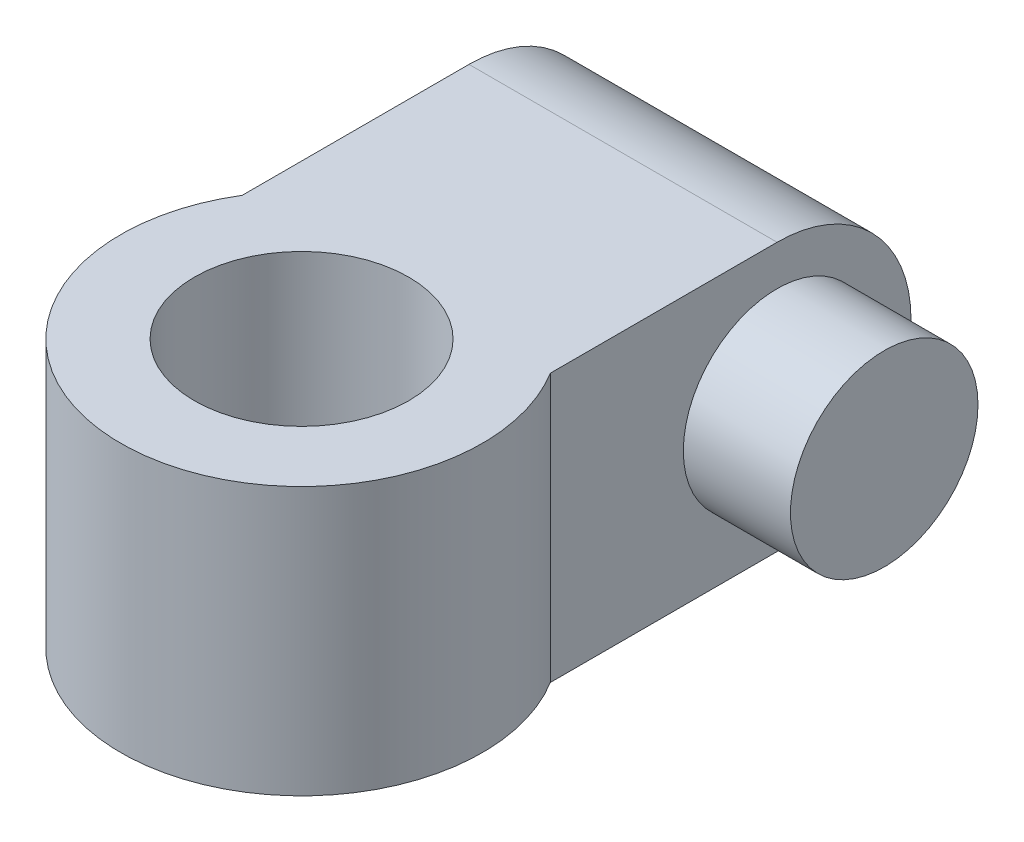
ISO-10303-21;
HEADER;
FILE_DESCRIPTION(('STEP AP214'),'2;1');
FILE_NAME('part.step','',(''),(''),'','','');
FILE_SCHEMA(('AUTOMOTIVE_DESIGN { 1 0 10303 214 1 1 1 1 }'));
ENDSEC;
DATA;
#1=APPLICATION_CONTEXT('core data for automotive mechanical design processes');
#2=APPLICATION_PROTOCOL_DEFINITION('international standard','automotive_design',2000,#1);
#3=PRODUCT_CONTEXT('',#1,'mechanical');
#4=PRODUCT('Part','Part','',(#3));
#5=PRODUCT_RELATED_PRODUCT_CATEGORY('part','',(#4));
#6=PRODUCT_DEFINITION_FORMATION('','',#4);
#7=PRODUCT_DEFINITION_CONTEXT('part definition',#1,'design');
#8=PRODUCT_DEFINITION('design','',#6,#7);
#9=PRODUCT_DEFINITION_SHAPE('','',#8);
#10=(LENGTH_UNIT() NAMED_UNIT(*) SI_UNIT(.MILLI.,.METRE.));
#11=(NAMED_UNIT(*) PLANE_ANGLE_UNIT() SI_UNIT($,.RADIAN.));
#12=(NAMED_UNIT(*) SI_UNIT($,.STERADIAN.) SOLID_ANGLE_UNIT());
#13=UNCERTAINTY_MEASURE_WITH_UNIT(LENGTH_MEASURE(1.E-05),#10,'distance_accuracy_value','');
#14=(GEOMETRIC_REPRESENTATION_CONTEXT(3) GLOBAL_UNCERTAINTY_ASSIGNED_CONTEXT((#13)) GLOBAL_UNIT_ASSIGNED_CONTEXT((#10,
#11,#12)) REPRESENTATION_CONTEXT('',''));
#15=CARTESIAN_POINT('',(0.,0.,0.));
#16=DIRECTION('',(0.,0.,1.));
#17=DIRECTION('',(1.,0.,0.));
#18=AXIS2_PLACEMENT_3D('',#15,#16,#17);
#19=CARTESIAN_POINT('',(0.,-5.,0.));
#20=DIRECTION('',(0.,1.,0.));
#21=DIRECTION('',(1.,0.,0.));
#22=AXIS2_PLACEMENT_3D('',#19,#20,#21);
#23=PLANE('',#22);
#24=DIRECTION('',(1.,0.,0.));
#25=VECTOR('',#24,1.);
#26=CARTESIAN_POINT('',(-5.75,-5.,-12.));
#27=LINE('',#26,#25);
#28=CARTESIAN_POINT('',(-5.75,-5.,-12.));
#29=VERTEX_POINT('',#28);
#30=CARTESIAN_POINT('',(5.75,-5.,-12.));
#31=VERTEX_POINT('',#30);
#32=EDGE_CURVE('E11',#29,#31,#27,.T.);
#33=ORIENTED_EDGE('',*,*,#32,.T.);
#34=DIRECTION('',(0.,0.,-1.));
#35=VECTOR('',#34,1.);
#36=CARTESIAN_POINT('',(5.75,-5.,-3.535533905933));
#37=LINE('',#36,#35);
#38=CARTESIAN_POINT('',(5.75,-5.,-3.535533905933));
#39=VERTEX_POINT('',#38);
#40=EDGE_CURVE('E36',#39,#31,#37,.T.);
#41=ORIENTED_EDGE('',*,*,#40,.F.);
#42=CARTESIAN_POINT('',(0.,-5.,0.));
#43=DIRECTION('',(0.,-1.,0.));
#44=DIRECTION('',(0.851851851851876,0.,-0.523782800878885));
#45=AXIS2_PLACEMENT_3D('',#42,#43,#44);
#46=CIRCLE('',#45,6.75);
#47=CARTESIAN_POINT('',(-5.75,-5.,-3.535533905933));
#48=VERTEX_POINT('',#47);
#49=EDGE_CURVE('E27',#39,#48,#46,.T.);
#50=ORIENTED_EDGE('',*,*,#49,.T.);
#51=DIRECTION('',(0.,0.,1.));
#52=VECTOR('',#51,1.);
#53=CARTESIAN_POINT('',(-5.75,-5.,-12.));
#54=LINE('',#53,#52);
#55=EDGE_CURVE('E97',#29,#48,#54,.T.);
#56=ORIENTED_EDGE('',*,*,#55,.F.);
#57=EDGE_LOOP('',(#33,#41,#50,#56));
#58=FACE_BOUND('',#57,.T.);
#59=CARTESIAN_POINT('',(0.,-5.,0.));
#60=DIRECTION('',(0.,-1.,0.));
#61=DIRECTION('',(-1.,0.,0.));
#62=AXIS2_PLACEMENT_3D('',#59,#60,#61);
#63=CIRCLE('',#62,4.);
#64=CARTESIAN_POINT('',(-4.,-5.,0.));
#65=VERTEX_POINT('',#64);
#66=EDGE_CURVE('E85',#65,#65,#63,.T.);
#67=ORIENTED_EDGE('',*,*,#66,.F.);
#68=EDGE_LOOP('',(#67));
#69=FACE_BOUND('',#68,.T.);
#70=ADVANCED_FACE('F17',(#58,#69),#23,.F.);
#71=CARTESIAN_POINT('',(-5.75,0.,0.));
#72=DIRECTION('',(1.,0.,0.));
#73=DIRECTION('',(0.,0.,-1.));
#74=AXIS2_PLACEMENT_3D('',#71,#72,#73);
#75=PLANE('',#74);
#76=DIRECTION('',(0.,0.,-1.));
#77=VECTOR('',#76,1.);
#78=CARTESIAN_POINT('',(-5.75,5.,-3.535533905933));
#79=LINE('',#78,#77);
#80=CARTESIAN_POINT('',(-5.75,5.,-3.535533905933));
#81=VERTEX_POINT('',#80);
#82=CARTESIAN_POINT('',(-5.75,5.,-12.));
#83=VERTEX_POINT('',#82);
#84=EDGE_CURVE('E99',#81,#83,#79,.T.);
#85=ORIENTED_EDGE('',*,*,#84,.T.);
#86=CARTESIAN_POINT('',(-5.75,0.,-12.));
#87=DIRECTION('',(1.,0.,0.));
#88=DIRECTION('',(0.,-1.,0.));
#89=AXIS2_PLACEMENT_3D('',#86,#87,#88);
#90=CIRCLE('',#89,5.);
#91=EDGE_CURVE('E72',#29,#83,#90,.T.);
#92=ORIENTED_EDGE('',*,*,#91,.F.);
#93=ORIENTED_EDGE('',*,*,#55,.T.);
#94=DIRECTION('',(0.,1.,0.));
#95=VECTOR('',#94,1.);
#96=CARTESIAN_POINT('',(-5.75,-5.,-3.535533905933));
#97=LINE('',#96,#95);
#98=EDGE_CURVE('E102',#48,#81,#97,.T.);
#99=ORIENTED_EDGE('',*,*,#98,.T.);
#100=EDGE_LOOP('',(#85,#92,#93,#99));
#101=FACE_BOUND('',#100,.T.);
#102=CARTESIAN_POINT('',(-5.75,0.,-12.));
#103=DIRECTION('',(-1.,0.,0.));
#104=DIRECTION('',(0.,0.,-1.));
#105=AXIS2_PLACEMENT_3D('',#102,#103,#104);
#106=CIRCLE('',#105,2.);
#107=CARTESIAN_POINT('',(-5.75,0.,-14.));
#108=VERTEX_POINT('',#107);
#109=EDGE_CURVE('E89',#108,#108,#106,.T.);
#110=ORIENTED_EDGE('',*,*,#109,.F.);
#111=EDGE_LOOP('',(#110));
#112=FACE_BOUND('',#111,.T.);
#113=ADVANCED_FACE('F123',(#101,#112),#75,.F.);
#114=CARTESIAN_POINT('',(0.,-5.,0.));
#115=DIRECTION('',(0.,1.,0.));
#116=DIRECTION('',(1.,0.,0.));
#117=AXIS2_PLACEMENT_3D('',#114,#115,#116);
#118=CYLINDRICAL_SURFACE('',#117,6.75);
#119=DIRECTION('',(0.,1.,0.));
#120=VECTOR('',#119,1.);
#121=CARTESIAN_POINT('',(5.75,-5.,-3.535533905933));
#122=LINE('',#121,#120);
#123=CARTESIAN_POINT('',(5.75,5.,-3.535533905933));
#124=VERTEX_POINT('',#123);
#125=EDGE_CURVE('E103',#39,#124,#122,.T.);
#126=ORIENTED_EDGE('',*,*,#125,.T.);
#127=CARTESIAN_POINT('',(0.,5.,0.));
#128=DIRECTION('',(0.,1.,0.));
#129=DIRECTION('',(-0.851851851851876,0.,-0.523782800878885));
#130=AXIS2_PLACEMENT_3D('',#127,#128,#129);
#131=CIRCLE('',#130,6.75);
#132=EDGE_CURVE('E55',#81,#124,#131,.T.);
#133=ORIENTED_EDGE('',*,*,#132,.F.);
#134=ORIENTED_EDGE('',*,*,#98,.F.);
#135=ORIENTED_EDGE('',*,*,#49,.F.);
#136=EDGE_LOOP('',(#126,#133,#134,#135));
#137=FACE_BOUND('',#136,.T.);
#138=ADVANCED_FACE('F129',(#137),#118,.T.);
#139=CARTESIAN_POINT('',(0.,5.,0.));
#140=DIRECTION('',(0.,1.,0.));
#141=DIRECTION('',(1.,0.,0.));
#142=AXIS2_PLACEMENT_3D('',#139,#140,#141);
#143=PLANE('',#142);
#144=DIRECTION('',(0.,0.,1.));
#145=VECTOR('',#144,1.);
#146=CARTESIAN_POINT('',(5.75,5.,-12.));
#147=LINE('',#146,#145);
#148=CARTESIAN_POINT('',(5.75,5.,-12.));
#149=VERTEX_POINT('',#148);
#150=EDGE_CURVE('E59',#149,#124,#147,.T.);
#151=ORIENTED_EDGE('',*,*,#150,.F.);
#152=DIRECTION('',(1.,0.,0.));
#153=VECTOR('',#152,1.);
#154=CARTESIAN_POINT('',(-5.75,5.,-12.));
#155=LINE('',#154,#153);
#156=EDGE_CURVE('E63',#83,#149,#155,.T.);
#157=ORIENTED_EDGE('',*,*,#156,.F.);
#158=ORIENTED_EDGE('',*,*,#84,.F.);
#159=ORIENTED_EDGE('',*,*,#132,.T.);
#160=EDGE_LOOP('',(#151,#157,#158,#159));
#161=FACE_BOUND('',#160,.T.);
#162=CARTESIAN_POINT('',(0.,5.,0.));
#163=DIRECTION('',(0.,-1.,0.));
#164=DIRECTION('',(-1.,0.,0.));
#165=AXIS2_PLACEMENT_3D('',#162,#163,#164);
#166=CIRCLE('',#165,4.);
#167=CARTESIAN_POINT('',(-4.,5.,0.));
#168=VERTEX_POINT('',#167);
#169=EDGE_CURVE('E74',#168,#168,#166,.T.);
#170=ORIENTED_EDGE('',*,*,#169,.T.);
#171=EDGE_LOOP('',(#170));
#172=FACE_BOUND('',#171,.T.);
#173=ADVANCED_FACE('F61',(#161,#172),#143,.T.);
#174=CARTESIAN_POINT('',(-5.75,0.,-12.));
#175=DIRECTION('',(1.,0.,0.));
#176=DIRECTION('',(0.,0.,-1.));
#177=AXIS2_PLACEMENT_3D('',#174,#175,#176);
#178=CYLINDRICAL_SURFACE('',#177,5.);
#179=ORIENTED_EDGE('',*,*,#156,.T.);
#180=CARTESIAN_POINT('',(5.75,0.,-12.));
#181=DIRECTION('',(1.,0.,0.));
#182=DIRECTION('',(0.,-1.,0.));
#183=AXIS2_PLACEMENT_3D('',#180,#181,#182);
#184=CIRCLE('',#183,5.);
#185=EDGE_CURVE('E64',#31,#149,#184,.T.);
#186=ORIENTED_EDGE('',*,*,#185,.F.);
#187=ORIENTED_EDGE('',*,*,#32,.F.);
#188=ORIENTED_EDGE('',*,*,#91,.T.);
#189=EDGE_LOOP('',(#179,#186,#187,#188));
#190=FACE_BOUND('',#189,.T.);
#191=ADVANCED_FACE('F69',(#190),#178,.T.);
#192=CARTESIAN_POINT('',(5.75,0.,0.));
#193=DIRECTION('',(1.,0.,0.));
#194=DIRECTION('',(0.,0.,-1.));
#195=AXIS2_PLACEMENT_3D('',#192,#193,#194);
#196=PLANE('',#195);
#197=ORIENTED_EDGE('',*,*,#40,.T.);
#198=ORIENTED_EDGE('',*,*,#185,.T.);
#199=ORIENTED_EDGE('',*,*,#150,.T.);
#200=ORIENTED_EDGE('',*,*,#125,.F.);
#201=EDGE_LOOP('',(#197,#198,#199,#200));
#202=FACE_BOUND('',#201,.T.);
#203=CARTESIAN_POINT('',(5.75,0.,-12.));
#204=DIRECTION('',(1.,0.,0.));
#205=DIRECTION('',(0.,0.,1.));
#206=AXIS2_PLACEMENT_3D('',#203,#204,#205);
#207=CIRCLE('',#206,3.5);
#208=CARTESIAN_POINT('',(5.75,0.,-8.5));
#209=VERTEX_POINT('',#208);
#210=EDGE_CURVE('E65',#209,#209,#207,.T.);
#211=ORIENTED_EDGE('',*,*,#210,.F.);
#212=EDGE_LOOP('',(#211));
#213=FACE_BOUND('',#212,.T.);
#214=ADVANCED_FACE('F76',(#202,#213),#196,.T.);
#215=CARTESIAN_POINT('',(5.75,0.,-12.));
#216=DIRECTION('',(1.,0.,0.));
#217=DIRECTION('',(0.,0.,-1.));
#218=AXIS2_PLACEMENT_3D('',#215,#216,#217);
#219=CYLINDRICAL_SURFACE('',#218,3.5);
#220=CARTESIAN_POINT('',(9.75,0.,-12.));
#221=DIRECTION('',(1.,0.,0.));
#222=DIRECTION('',(0.,0.,-1.));
#223=AXIS2_PLACEMENT_3D('',#220,#221,#222);
#224=CIRCLE('',#223,3.5);
#225=CARTESIAN_POINT('',(9.75,0.,-15.5));
#226=VERTEX_POINT('',#225);
#227=EDGE_CURVE('E83',#226,#226,#224,.T.);
#228=ORIENTED_EDGE('',*,*,#227,.F.);
#229=EDGE_LOOP('',(#228));
#230=FACE_BOUND('',#229,.T.);
#231=ORIENTED_EDGE('',*,*,#210,.T.);
#232=EDGE_LOOP('',(#231));
#233=FACE_BOUND('',#232,.T.);
#234=ADVANCED_FACE('F120',(#230,#233),#219,.T.);
#235=CARTESIAN_POINT('',(9.75,0.,0.));
#236=DIRECTION('',(1.,0.,0.));
#237=DIRECTION('',(0.,0.,-1.));
#238=AXIS2_PLACEMENT_3D('',#235,#236,#237);
#239=PLANE('',#238);
#240=ORIENTED_EDGE('',*,*,#227,.T.);
#241=EDGE_LOOP('',(#240));
#242=FACE_BOUND('',#241,.T.);
#243=ADVANCED_FACE('F112',(#242),#239,.T.);
#244=CARTESIAN_POINT('',(0.,5.,0.));
#245=DIRECTION('',(0.,-1.,0.));
#246=DIRECTION('',(1.,0.,0.));
#247=AXIS2_PLACEMENT_3D('',#244,#245,#246);
#248=CYLINDRICAL_SURFACE('',#247,4.);
#249=ORIENTED_EDGE('',*,*,#66,.T.);
#250=EDGE_LOOP('',(#249));
#251=FACE_BOUND('',#250,.T.);
#252=ORIENTED_EDGE('',*,*,#169,.F.);
#253=EDGE_LOOP('',(#252));
#254=FACE_BOUND('',#253,.T.);
#255=ADVANCED_FACE('F109',(#251,#254),#248,.F.);
#256=CARTESIAN_POINT('',(-5.75,0.,-12.));
#257=DIRECTION('',(-1.,0.,0.));
#258=DIRECTION('',(0.,0.,1.));
#259=AXIS2_PLACEMENT_3D('',#256,#257,#258);
#260=CYLINDRICAL_SURFACE('',#259,2.);
#261=CARTESIAN_POINT('',(-8.75,0.,-12.));
#262=DIRECTION('',(-1.,0.,0.));
#263=DIRECTION('',(0.,0.,1.));
#264=AXIS2_PLACEMENT_3D('',#261,#262,#263);
#265=CIRCLE('',#264,2.);
#266=CARTESIAN_POINT('',(-8.75,0.,-10.));
#267=VERTEX_POINT('',#266);
#268=EDGE_CURVE('E21',#267,#267,#265,.T.);
#269=ORIENTED_EDGE('',*,*,#268,.F.);
#270=EDGE_LOOP('',(#269));
#271=FACE_BOUND('',#270,.T.);
#272=ORIENTED_EDGE('',*,*,#109,.T.);
#273=EDGE_LOOP('',(#272));
#274=FACE_BOUND('',#273,.T.);
#275=ADVANCED_FACE('F111',(#271,#274),#260,.T.);
#276=CARTESIAN_POINT('',(-8.75,0.,0.));
#277=DIRECTION('',(-1.,0.,0.));
#278=DIRECTION('',(0.,0.,1.));
#279=AXIS2_PLACEMENT_3D('',#276,#277,#278);
#280=PLANE('',#279);
#281=ORIENTED_EDGE('',*,*,#268,.T.);
#282=EDGE_LOOP('',(#281));
#283=FACE_BOUND('',#282,.T.);
#284=ADVANCED_FACE('F19',(#283),#280,.T.);
#285=CLOSED_SHELL('',(#70,#113,#138,#173,#191,#214,#234,#243,#255,#275,#284));
#286=MANIFOLD_SOLID_BREP('B1',#285);
#287=ADVANCED_BREP_SHAPE_REPRESENTATION('',(#18,#286),#14);
#288=SHAPE_DEFINITION_REPRESENTATION(#9,#287);
ENDSEC;
END-ISO-10303-21;
